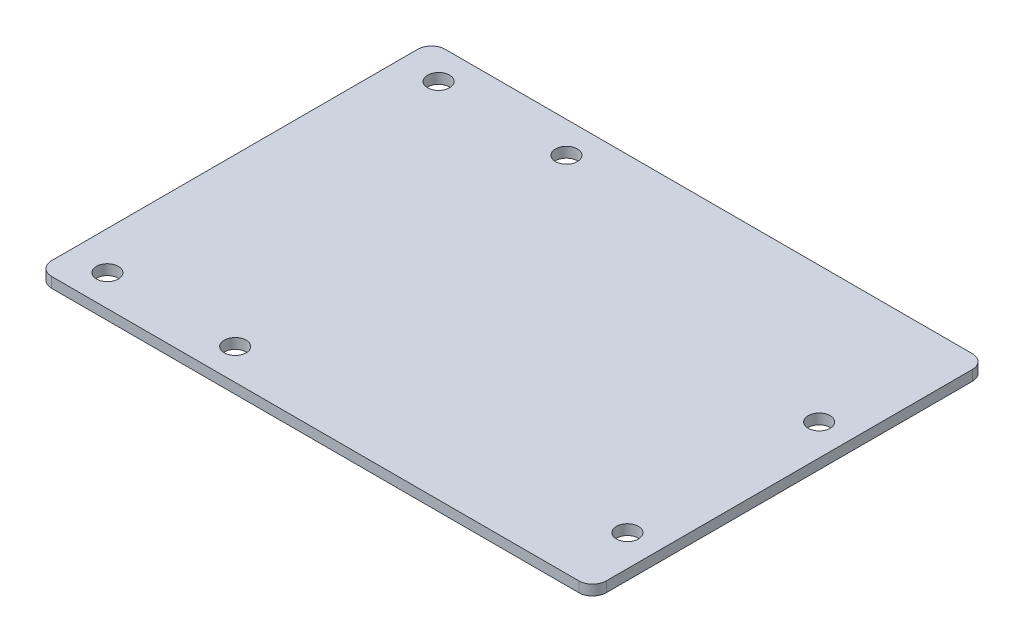
ISO-10303-21;
HEADER;
FILE_DESCRIPTION(('STEP AP214'),'2;1');
FILE_NAME('part.step','',(''),(''),'','','');
FILE_SCHEMA(('AUTOMOTIVE_DESIGN { 1 0 10303 214 1 1 1 1 }'));
ENDSEC;
DATA;
#1=APPLICATION_CONTEXT('core data for automotive mechanical design processes');
#2=APPLICATION_PROTOCOL_DEFINITION('international standard','automotive_design',2000,#1);
#3=PRODUCT_CONTEXT('',#1,'mechanical');
#4=PRODUCT('Part','Part','',(#3));
#5=PRODUCT_RELATED_PRODUCT_CATEGORY('part','',(#4));
#6=PRODUCT_DEFINITION_FORMATION('','',#4);
#7=PRODUCT_DEFINITION_CONTEXT('part definition',#1,'design');
#8=PRODUCT_DEFINITION('design','',#6,#7);
#9=PRODUCT_DEFINITION_SHAPE('','',#8);
#10=(LENGTH_UNIT() NAMED_UNIT(*) SI_UNIT(.MILLI.,.METRE.));
#11=(NAMED_UNIT(*) PLANE_ANGLE_UNIT() SI_UNIT($,.RADIAN.));
#12=(NAMED_UNIT(*) SI_UNIT($,.STERADIAN.) SOLID_ANGLE_UNIT());
#13=UNCERTAINTY_MEASURE_WITH_UNIT(LENGTH_MEASURE(1.E-05),#10,'distance_accuracy_value','');
#14=(GEOMETRIC_REPRESENTATION_CONTEXT(3) GLOBAL_UNCERTAINTY_ASSIGNED_CONTEXT((#13)) GLOBAL_UNIT_ASSIGNED_CONTEXT((#10,
#11,#12)) REPRESENTATION_CONTEXT('',''));
#15=CARTESIAN_POINT('',(0.,0.,0.));
#16=DIRECTION('',(0.,0.,1.));
#17=DIRECTION('',(1.,0.,0.));
#18=AXIS2_PLACEMENT_3D('',#15,#16,#17);
#19=CARTESIAN_POINT('',(0.,1.5,0.));
#20=DIRECTION('',(0.,1.,0.));
#21=DIRECTION('',(0.,0.,1.));
#22=AXIS2_PLACEMENT_3D('',#19,#20,#21);
#23=PLANE('',#22);
#24=CARTESIAN_POINT('',(32.96,1.5,19.05));
#25=DIRECTION('',(0.,1.,0.));
#26=DIRECTION('',(0.,0.,1.));
#27=AXIS2_PLACEMENT_3D('',#24,#25,#26);
#28=CIRCLE('',#27,1.6);
#29=CARTESIAN_POINT('',(32.96,1.5,20.65));
#30=VERTEX_POINT('',#29);
#31=EDGE_CURVE('E204',#30,#30,#28,.T.);
#32=ORIENTED_EDGE('',*,*,#31,.F.);
#33=EDGE_LOOP('',(#32));
#34=FACE_BOUND('',#33,.T.);
#35=CARTESIAN_POINT('',(-19.11,1.5,24.13));
#36=DIRECTION('',(0.,1.,0.));
#37=DIRECTION('',(0.,0.,1.));
#38=AXIS2_PLACEMENT_3D('',#35,#36,#37);
#39=CIRCLE('',#38,1.6);
#40=CARTESIAN_POINT('',(-19.11,1.5,25.73));
#41=VERTEX_POINT('',#40);
#42=EDGE_CURVE('E192',#41,#41,#39,.T.);
#43=ORIENTED_EDGE('',*,*,#42,.F.);
#44=EDGE_LOOP('',(#43));
#45=FACE_BOUND('',#44,.T.);
#46=CARTESIAN_POINT('',(-19.11,1.5,-24.13));
#47=DIRECTION('',(0.,1.,0.));
#48=DIRECTION('',(0.,0.,-1.));
#49=AXIS2_PLACEMENT_3D('',#46,#47,#48);
#50=CIRCLE('',#49,1.6);
#51=CARTESIAN_POINT('',(-19.11,1.5,-25.73));
#52=VERTEX_POINT('',#51);
#53=EDGE_CURVE('E182',#52,#52,#50,.T.);
#54=ORIENTED_EDGE('',*,*,#53,.F.);
#55=EDGE_LOOP('',(#54));
#56=FACE_BOUND('',#55,.T.);
#57=DIRECTION('',(-1.,0.,0.));
#58=VECTOR('',#57,1.);
#59=CARTESIAN_POINT('',(-43.3191078535778,1.5,-28.67));
#60=LINE('',#59,#58);
#61=CARTESIAN_POINT('',(35.5,1.5,-28.67));
#62=VERTEX_POINT('',#61);
#63=CARTESIAN_POINT('',(-41.3191078535778,1.5,-28.67));
#64=VERTEX_POINT('',#63);
#65=EDGE_CURVE('E173',#62,#64,#60,.T.);
#66=ORIENTED_EDGE('',*,*,#65,.T.);
#67=CARTESIAN_POINT('',(-41.3191078535778,1.5,-26.67));
#68=DIRECTION('',(0.,1.,0.));
#69=DIRECTION('',(0.,0.,1.));
#70=AXIS2_PLACEMENT_3D('',#67,#68,#69);
#71=CIRCLE('',#70,2.);
#72=CARTESIAN_POINT('',(-43.3191078535778,1.5,-26.67));
#73=VERTEX_POINT('',#72);
#74=EDGE_CURVE('E151',#64,#73,#71,.T.);
#75=ORIENTED_EDGE('',*,*,#74,.T.);
#76=DIRECTION('',(0.,0.,1.));
#77=VECTOR('',#76,1.);
#78=CARTESIAN_POINT('',(-43.3191078535778,1.5,-28.67));
#79=LINE('',#78,#77);
#80=CARTESIAN_POINT('',(-43.3191078535778,1.5,26.67));
#81=VERTEX_POINT('',#80);
#82=EDGE_CURVE('E121',#73,#81,#79,.T.);
#83=ORIENTED_EDGE('',*,*,#82,.T.);
#84=CARTESIAN_POINT('',(-41.3191078535778,1.5,26.67));
#85=DIRECTION('',(0.,1.,0.));
#86=DIRECTION('',(0.,0.,1.));
#87=AXIS2_PLACEMENT_3D('',#84,#85,#86);
#88=CIRCLE('',#87,2.);
#89=CARTESIAN_POINT('',(-41.3191078535778,1.5,28.67));
#90=VERTEX_POINT('',#89);
#91=EDGE_CURVE('E57',#81,#90,#88,.T.);
#92=ORIENTED_EDGE('',*,*,#91,.T.);
#93=DIRECTION('',(1.,0.,0.));
#94=VECTOR('',#93,1.);
#95=CARTESIAN_POINT('',(-43.3191078535778,1.5,28.67));
#96=LINE('',#95,#94);
#97=CARTESIAN_POINT('',(35.5,1.5,28.67));
#98=VERTEX_POINT('',#97);
#99=EDGE_CURVE('E137',#90,#98,#96,.T.);
#100=ORIENTED_EDGE('',*,*,#99,.T.);
#101=CARTESIAN_POINT('',(35.5,1.5,26.67));
#102=DIRECTION('',(0.,1.,0.));
#103=DIRECTION('',(0.,0.,1.));
#104=AXIS2_PLACEMENT_3D('',#101,#102,#103);
#105=CIRCLE('',#104,2.);
#106=CARTESIAN_POINT('',(37.5,1.5,26.67));
#107=VERTEX_POINT('',#106);
#108=EDGE_CURVE('E147',#98,#107,#105,.T.);
#109=ORIENTED_EDGE('',*,*,#108,.T.);
#110=DIRECTION('',(0.,0.,-1.));
#111=VECTOR('',#110,1.);
#112=CARTESIAN_POINT('',(37.5,1.5,-28.67));
#113=LINE('',#112,#111);
#114=CARTESIAN_POINT('',(37.5,1.5,-26.67));
#115=VERTEX_POINT('',#114);
#116=EDGE_CURVE('E131',#107,#115,#113,.T.);
#117=ORIENTED_EDGE('',*,*,#116,.T.);
#118=CARTESIAN_POINT('',(35.5,1.5,-26.67));
#119=DIRECTION('',(0.,1.,0.));
#120=DIRECTION('',(0.,0.,1.));
#121=AXIS2_PLACEMENT_3D('',#118,#119,#120);
#122=CIRCLE('',#121,2.);
#123=EDGE_CURVE('E149',#115,#62,#122,.T.);
#124=ORIENTED_EDGE('',*,*,#123,.T.);
#125=EDGE_LOOP('',(#66,#75,#83,#92,#100,#109,#117,#124));
#126=FACE_BOUND('',#125,.T.);
#127=CARTESIAN_POINT('',(-37.736271759555,1.5,-24.13));
#128=DIRECTION('',(0.,1.,0.));
#129=DIRECTION('',(0.,0.,1.));
#130=AXIS2_PLACEMENT_3D('',#127,#128,#129);
#131=CIRCLE('',#130,1.6);
#132=CARTESIAN_POINT('',(-37.736271759555,1.5,-22.53));
#133=VERTEX_POINT('',#132);
#134=EDGE_CURVE('E187',#133,#133,#131,.T.);
#135=ORIENTED_EDGE('',*,*,#134,.F.);
#136=EDGE_LOOP('',(#135));
#137=FACE_BOUND('',#136,.T.);
#138=CARTESIAN_POINT('',(-37.736271759555,1.5,24.13));
#139=DIRECTION('',(0.,1.,0.));
#140=DIRECTION('',(0.,0.,-1.));
#141=AXIS2_PLACEMENT_3D('',#138,#139,#140);
#142=CIRCLE('',#141,1.6);
#143=CARTESIAN_POINT('',(-37.736271759555,1.5,22.53));
#144=VERTEX_POINT('',#143);
#145=EDGE_CURVE('E198',#144,#144,#142,.T.);
#146=ORIENTED_EDGE('',*,*,#145,.F.);
#147=EDGE_LOOP('',(#146));
#148=FACE_BOUND('',#147,.T.);
#149=CARTESIAN_POINT('',(32.96,1.5,-8.89000000000001));
#150=DIRECTION('',(0.,1.,0.));
#151=DIRECTION('',(0.,0.,1.));
#152=AXIS2_PLACEMENT_3D('',#149,#150,#151);
#153=CIRCLE('',#152,1.6);
#154=CARTESIAN_POINT('',(32.96,1.5,-7.29));
#155=VERTEX_POINT('',#154);
#156=EDGE_CURVE('E210',#155,#155,#153,.T.);
#157=ORIENTED_EDGE('',*,*,#156,.F.);
#158=EDGE_LOOP('',(#157));
#159=FACE_BOUND('',#158,.T.);
#160=ADVANCED_FACE('F37',(#34,#45,#56,#126,#137,#148,#159),#23,.T.);
#161=CARTESIAN_POINT('',(0.,0.,0.));
#162=DIRECTION('',(0.,1.,0.));
#163=DIRECTION('',(0.,0.,1.));
#164=AXIS2_PLACEMENT_3D('',#161,#162,#163);
#165=PLANE('',#164);
#166=DIRECTION('',(0.,0.,1.));
#167=VECTOR('',#166,1.);
#168=CARTESIAN_POINT('',(-43.3191078535778,0.,-28.67));
#169=LINE('',#168,#167);
#170=CARTESIAN_POINT('',(-43.3191078535778,0.,-26.67));
#171=VERTEX_POINT('',#170);
#172=CARTESIAN_POINT('',(-43.3191078535778,0.,26.67));
#173=VERTEX_POINT('',#172);
#174=EDGE_CURVE('E119',#171,#173,#169,.T.);
#175=ORIENTED_EDGE('',*,*,#174,.F.);
#176=CARTESIAN_POINT('',(-41.3191078535778,0.,-26.67));
#177=DIRECTION('',(0.,1.,0.));
#178=DIRECTION('',(0.,0.,1.));
#179=AXIS2_PLACEMENT_3D('',#176,#177,#178);
#180=CIRCLE('',#179,2.);
#181=CARTESIAN_POINT('',(-41.3191078535778,0.,-28.67));
#182=VERTEX_POINT('',#181);
#183=EDGE_CURVE('E102',#171,#182,#180,.F.);
#184=ORIENTED_EDGE('',*,*,#183,.T.);
#185=DIRECTION('',(-1.,0.,0.));
#186=VECTOR('',#185,1.);
#187=CARTESIAN_POINT('',(-43.3191078535778,0.,-28.67));
#188=LINE('',#187,#186);
#189=CARTESIAN_POINT('',(35.5,0.,-28.67));
#190=VERTEX_POINT('',#189);
#191=EDGE_CURVE('E129',#190,#182,#188,.T.);
#192=ORIENTED_EDGE('',*,*,#191,.F.);
#193=CARTESIAN_POINT('',(35.5,0.,-26.67));
#194=DIRECTION('',(0.,1.,0.));
#195=DIRECTION('',(0.,0.,1.));
#196=AXIS2_PLACEMENT_3D('',#193,#194,#195);
#197=CIRCLE('',#196,2.);
#198=CARTESIAN_POINT('',(37.5,0.,-26.67));
#199=VERTEX_POINT('',#198);
#200=EDGE_CURVE('E113',#190,#199,#197,.F.);
#201=ORIENTED_EDGE('',*,*,#200,.T.);
#202=DIRECTION('',(0.,0.,-1.));
#203=VECTOR('',#202,1.);
#204=CARTESIAN_POINT('',(37.5,0.,-28.67));
#205=LINE('',#204,#203);
#206=CARTESIAN_POINT('',(37.5,0.,26.67));
#207=VERTEX_POINT('',#206);
#208=EDGE_CURVE('E133',#207,#199,#205,.T.);
#209=ORIENTED_EDGE('',*,*,#208,.F.);
#210=CARTESIAN_POINT('',(35.5,0.,26.67));
#211=DIRECTION('',(0.,1.,0.));
#212=DIRECTION('',(0.,0.,1.));
#213=AXIS2_PLACEMENT_3D('',#210,#211,#212);
#214=CIRCLE('',#213,2.);
#215=CARTESIAN_POINT('',(35.5,0.,28.67));
#216=VERTEX_POINT('',#215);
#217=EDGE_CURVE('E140',#207,#216,#214,.F.);
#218=ORIENTED_EDGE('',*,*,#217,.T.);
#219=DIRECTION('',(1.,0.,0.));
#220=VECTOR('',#219,1.);
#221=CARTESIAN_POINT('',(-43.3191078535778,0.,28.67));
#222=LINE('',#221,#220);
#223=CARTESIAN_POINT('',(-41.3191078535778,0.,28.67));
#224=VERTEX_POINT('',#223);
#225=EDGE_CURVE('E128',#224,#216,#222,.T.);
#226=ORIENTED_EDGE('',*,*,#225,.F.);
#227=CARTESIAN_POINT('',(-41.3191078535778,0.,26.67));
#228=DIRECTION('',(0.,1.,0.));
#229=DIRECTION('',(0.,0.,1.));
#230=AXIS2_PLACEMENT_3D('',#227,#228,#229);
#231=CIRCLE('',#230,2.);
#232=EDGE_CURVE('E122',#224,#173,#231,.F.);
#233=ORIENTED_EDGE('',*,*,#232,.T.);
#234=EDGE_LOOP('',(#175,#184,#192,#201,#209,#218,#226,#233));
#235=FACE_BOUND('',#234,.T.);
#236=CARTESIAN_POINT('',(-19.11,0.,-24.13));
#237=DIRECTION('',(0.,1.,0.));
#238=DIRECTION('',(0.,0.,-1.));
#239=AXIS2_PLACEMENT_3D('',#236,#237,#238);
#240=CIRCLE('',#239,1.6);
#241=CARTESIAN_POINT('',(-19.11,0.,-25.73));
#242=VERTEX_POINT('',#241);
#243=EDGE_CURVE('E178',#242,#242,#240,.T.);
#244=ORIENTED_EDGE('',*,*,#243,.T.);
#245=EDGE_LOOP('',(#244));
#246=FACE_BOUND('',#245,.T.);
#247=CARTESIAN_POINT('',(-37.736271759555,0.,-24.13));
#248=DIRECTION('',(0.,1.,0.));
#249=DIRECTION('',(0.,0.,1.));
#250=AXIS2_PLACEMENT_3D('',#247,#248,#249);
#251=CIRCLE('',#250,1.6);
#252=CARTESIAN_POINT('',(-37.736271759555,0.,-22.53));
#253=VERTEX_POINT('',#252);
#254=EDGE_CURVE('E189',#253,#253,#251,.T.);
#255=ORIENTED_EDGE('',*,*,#254,.T.);
#256=EDGE_LOOP('',(#255));
#257=FACE_BOUND('',#256,.T.);
#258=CARTESIAN_POINT('',(-19.11,0.,24.13));
#259=DIRECTION('',(0.,1.,0.));
#260=DIRECTION('',(0.,0.,1.));
#261=AXIS2_PLACEMENT_3D('',#258,#259,#260);
#262=CIRCLE('',#261,1.6);
#263=CARTESIAN_POINT('',(-19.11,0.,25.73));
#264=VERTEX_POINT('',#263);
#265=EDGE_CURVE('E195',#264,#264,#262,.T.);
#266=ORIENTED_EDGE('',*,*,#265,.T.);
#267=EDGE_LOOP('',(#266));
#268=FACE_BOUND('',#267,.T.);
#269=CARTESIAN_POINT('',(-37.736271759555,0.,24.13));
#270=DIRECTION('',(0.,1.,0.));
#271=DIRECTION('',(0.,0.,-1.));
#272=AXIS2_PLACEMENT_3D('',#269,#270,#271);
#273=CIRCLE('',#272,1.6);
#274=CARTESIAN_POINT('',(-37.736271759555,0.,22.53));
#275=VERTEX_POINT('',#274);
#276=EDGE_CURVE('E201',#275,#275,#273,.T.);
#277=ORIENTED_EDGE('',*,*,#276,.T.);
#278=EDGE_LOOP('',(#277));
#279=FACE_BOUND('',#278,.T.);
#280=CARTESIAN_POINT('',(32.96,0.,19.05));
#281=DIRECTION('',(0.,1.,0.));
#282=DIRECTION('',(0.,0.,1.));
#283=AXIS2_PLACEMENT_3D('',#280,#281,#282);
#284=CIRCLE('',#283,1.6);
#285=CARTESIAN_POINT('',(32.96,0.,20.65));
#286=VERTEX_POINT('',#285);
#287=EDGE_CURVE('E207',#286,#286,#284,.T.);
#288=ORIENTED_EDGE('',*,*,#287,.T.);
#289=EDGE_LOOP('',(#288));
#290=FACE_BOUND('',#289,.T.);
#291=CARTESIAN_POINT('',(32.96,0.,-8.89000000000001));
#292=DIRECTION('',(0.,1.,0.));
#293=DIRECTION('',(0.,0.,1.));
#294=AXIS2_PLACEMENT_3D('',#291,#292,#293);
#295=CIRCLE('',#294,1.6);
#296=CARTESIAN_POINT('',(32.96,0.,-7.29));
#297=VERTEX_POINT('',#296);
#298=EDGE_CURVE('E213',#297,#297,#295,.T.);
#299=ORIENTED_EDGE('',*,*,#298,.T.);
#300=EDGE_LOOP('',(#299));
#301=FACE_BOUND('',#300,.T.);
#302=ADVANCED_FACE('F125',(#235,#246,#257,#268,#279,#290,#301),#165,.F.);
#303=CARTESIAN_POINT('',(37.5,1.5,-28.67));
#304=DIRECTION('',(-1.,0.,0.));
#305=DIRECTION('',(0.,0.,1.));
#306=AXIS2_PLACEMENT_3D('',#303,#304,#305);
#307=PLANE('',#306);
#308=ORIENTED_EDGE('',*,*,#208,.T.);
#309=DIRECTION('',(0.,-1.,0.));
#310=VECTOR('',#309,1.);
#311=CARTESIAN_POINT('',(37.5,1.5,-26.67));
#312=LINE('',#311,#310);
#313=EDGE_CURVE('E156',#199,#115,#312,.F.);
#314=ORIENTED_EDGE('',*,*,#313,.T.);
#315=ORIENTED_EDGE('',*,*,#116,.F.);
#316=DIRECTION('',(0.,-1.,0.));
#317=VECTOR('',#316,1.);
#318=CARTESIAN_POINT('',(37.5,1.5,26.67));
#319=LINE('',#318,#317);
#320=EDGE_CURVE('E153',#107,#207,#319,.T.);
#321=ORIENTED_EDGE('',*,*,#320,.T.);
#322=EDGE_LOOP('',(#308,#314,#315,#321));
#323=FACE_BOUND('',#322,.T.);
#324=ADVANCED_FACE('F169',(#323),#307,.F.);
#325=CARTESIAN_POINT('',(-43.3191078535778,1.5,-28.67));
#326=DIRECTION('',(0.,0.,1.));
#327=DIRECTION('',(1.,0.,0.));
#328=AXIS2_PLACEMENT_3D('',#325,#326,#327);
#329=PLANE('',#328);
#330=ORIENTED_EDGE('',*,*,#191,.T.);
#331=DIRECTION('',(0.,-1.,0.));
#332=VECTOR('',#331,1.);
#333=CARTESIAN_POINT('',(-41.3191078535778,1.5,-28.67));
#334=LINE('',#333,#332);
#335=EDGE_CURVE('E107',#182,#64,#334,.F.);
#336=ORIENTED_EDGE('',*,*,#335,.T.);
#337=ORIENTED_EDGE('',*,*,#65,.F.);
#338=DIRECTION('',(0.,-1.,0.));
#339=VECTOR('',#338,1.);
#340=CARTESIAN_POINT('',(35.5,1.5,-28.67));
#341=LINE('',#340,#339);
#342=EDGE_CURVE('E112',#62,#190,#341,.T.);
#343=ORIENTED_EDGE('',*,*,#342,.T.);
#344=EDGE_LOOP('',(#330,#336,#337,#343));
#345=FACE_BOUND('',#344,.T.);
#346=ADVANCED_FACE('F238',(#345),#329,.F.);
#347=CARTESIAN_POINT('',(-43.3191078535778,1.5,-28.67));
#348=DIRECTION('',(1.,0.,0.));
#349=DIRECTION('',(0.,0.,-1.));
#350=AXIS2_PLACEMENT_3D('',#347,#348,#349);
#351=PLANE('',#350);
#352=ORIENTED_EDGE('',*,*,#82,.F.);
#353=DIRECTION('',(0.,-1.,0.));
#354=VECTOR('',#353,1.);
#355=CARTESIAN_POINT('',(-43.3191078535778,1.5,-26.67));
#356=LINE('',#355,#354);
#357=EDGE_CURVE('E106',#73,#171,#356,.T.);
#358=ORIENTED_EDGE('',*,*,#357,.T.);
#359=ORIENTED_EDGE('',*,*,#174,.T.);
#360=DIRECTION('',(0.,-1.,0.));
#361=VECTOR('',#360,1.);
#362=CARTESIAN_POINT('',(-43.3191078535778,1.5,26.67));
#363=LINE('',#362,#361);
#364=EDGE_CURVE('E123',#173,#81,#363,.F.);
#365=ORIENTED_EDGE('',*,*,#364,.T.);
#366=EDGE_LOOP('',(#352,#358,#359,#365));
#367=FACE_BOUND('',#366,.T.);
#368=ADVANCED_FACE('F118',(#367),#351,.F.);
#369=CARTESIAN_POINT('',(-43.3191078535778,1.5,28.67));
#370=DIRECTION('',(0.,0.,-1.));
#371=DIRECTION('',(-1.,0.,0.));
#372=AXIS2_PLACEMENT_3D('',#369,#370,#371);
#373=PLANE('',#372);
#374=ORIENTED_EDGE('',*,*,#225,.T.);
#375=DIRECTION('',(0.,-1.,0.));
#376=VECTOR('',#375,1.);
#377=CARTESIAN_POINT('',(35.5,1.5,28.67));
#378=LINE('',#377,#376);
#379=EDGE_CURVE('E11',#216,#98,#378,.F.);
#380=ORIENTED_EDGE('',*,*,#379,.T.);
#381=ORIENTED_EDGE('',*,*,#99,.F.);
#382=DIRECTION('',(0.,-1.,0.));
#383=VECTOR('',#382,1.);
#384=CARTESIAN_POINT('',(-41.3191078535778,1.5,28.67));
#385=LINE('',#384,#383);
#386=EDGE_CURVE('E45',#90,#224,#385,.T.);
#387=ORIENTED_EDGE('',*,*,#386,.T.);
#388=EDGE_LOOP('',(#374,#380,#381,#387));
#389=FACE_BOUND('',#388,.T.);
#390=ADVANCED_FACE('F159',(#389),#373,.F.);
#391=CARTESIAN_POINT('',(-19.11,1.5,-24.13));
#392=DIRECTION('',(0.,-1.,0.));
#393=DIRECTION('',(0.,0.,-1.));
#394=AXIS2_PLACEMENT_3D('',#391,#392,#393);
#395=CYLINDRICAL_SURFACE('',#394,1.6);
#396=ORIENTED_EDGE('',*,*,#243,.F.);
#397=EDGE_LOOP('',(#396));
#398=FACE_BOUND('',#397,.T.);
#399=ORIENTED_EDGE('',*,*,#53,.T.);
#400=EDGE_LOOP('',(#399));
#401=FACE_BOUND('',#400,.T.);
#402=ADVANCED_FACE('F231',(#398,#401),#395,.F.);
#403=CARTESIAN_POINT('',(-37.736271759555,1.5,-24.13));
#404=DIRECTION('',(0.,-1.,0.));
#405=DIRECTION('',(0.,0.,-1.));
#406=AXIS2_PLACEMENT_3D('',#403,#404,#405);
#407=CYLINDRICAL_SURFACE('',#406,1.6);
#408=ORIENTED_EDGE('',*,*,#134,.T.);
#409=EDGE_LOOP('',(#408));
#410=FACE_BOUND('',#409,.T.);
#411=ORIENTED_EDGE('',*,*,#254,.F.);
#412=EDGE_LOOP('',(#411));
#413=FACE_BOUND('',#412,.T.);
#414=ADVANCED_FACE('F284',(#410,#413),#407,.F.);
#415=CARTESIAN_POINT('',(-19.11,1.5,24.13));
#416=DIRECTION('',(0.,-1.,0.));
#417=DIRECTION('',(0.,0.,-1.));
#418=AXIS2_PLACEMENT_3D('',#415,#416,#417);
#419=CYLINDRICAL_SURFACE('',#418,1.6);
#420=ORIENTED_EDGE('',*,*,#265,.F.);
#421=EDGE_LOOP('',(#420));
#422=FACE_BOUND('',#421,.T.);
#423=ORIENTED_EDGE('',*,*,#42,.T.);
#424=EDGE_LOOP('',(#423));
#425=FACE_BOUND('',#424,.T.);
#426=ADVANCED_FACE('F266',(#422,#425),#419,.F.);
#427=CARTESIAN_POINT('',(-37.736271759555,1.5,24.13));
#428=DIRECTION('',(0.,-1.,0.));
#429=DIRECTION('',(0.,0.,-1.));
#430=AXIS2_PLACEMENT_3D('',#427,#428,#429);
#431=CYLINDRICAL_SURFACE('',#430,1.6);
#432=ORIENTED_EDGE('',*,*,#145,.T.);
#433=EDGE_LOOP('',(#432));
#434=FACE_BOUND('',#433,.T.);
#435=ORIENTED_EDGE('',*,*,#276,.F.);
#436=EDGE_LOOP('',(#435));
#437=FACE_BOUND('',#436,.T.);
#438=ADVANCED_FACE('F262',(#434,#437),#431,.F.);
#439=CARTESIAN_POINT('',(32.96,1.5,19.05));
#440=DIRECTION('',(0.,-1.,0.));
#441=DIRECTION('',(0.,0.,-1.));
#442=AXIS2_PLACEMENT_3D('',#439,#440,#441);
#443=CYLINDRICAL_SURFACE('',#442,1.6);
#444=ORIENTED_EDGE('',*,*,#287,.F.);
#445=EDGE_LOOP('',(#444));
#446=FACE_BOUND('',#445,.T.);
#447=ORIENTED_EDGE('',*,*,#31,.T.);
#448=EDGE_LOOP('',(#447));
#449=FACE_BOUND('',#448,.T.);
#450=ADVANCED_FACE('F265',(#446,#449),#443,.F.);
#451=CARTESIAN_POINT('',(32.96,1.5,-8.89000000000001));
#452=DIRECTION('',(0.,-1.,0.));
#453=DIRECTION('',(0.,0.,-1.));
#454=AXIS2_PLACEMENT_3D('',#451,#452,#453);
#455=CYLINDRICAL_SURFACE('',#454,1.6);
#456=ORIENTED_EDGE('',*,*,#298,.F.);
#457=EDGE_LOOP('',(#456));
#458=FACE_BOUND('',#457,.T.);
#459=ORIENTED_EDGE('',*,*,#156,.T.);
#460=EDGE_LOOP('',(#459));
#461=FACE_BOUND('',#460,.T.);
#462=ADVANCED_FACE('F219',(#458,#461),#455,.F.);
#463=CARTESIAN_POINT('',(-41.3191078535778,1.5,-26.67));
#464=DIRECTION('',(0.,-1.,0.));
#465=DIRECTION('',(0.,0.,-1.));
#466=AXIS2_PLACEMENT_3D('',#463,#464,#465);
#467=CYLINDRICAL_SURFACE('',#466,2.);
#468=ORIENTED_EDGE('',*,*,#74,.F.);
#469=ORIENTED_EDGE('',*,*,#335,.F.);
#470=ORIENTED_EDGE('',*,*,#183,.F.);
#471=ORIENTED_EDGE('',*,*,#357,.F.);
#472=EDGE_LOOP('',(#468,#469,#470,#471));
#473=FACE_BOUND('',#472,.T.);
#474=ADVANCED_FACE('F105',(#473),#467,.T.);
#475=CARTESIAN_POINT('',(35.5,1.5,-26.67));
#476=DIRECTION('',(0.,-1.,0.));
#477=DIRECTION('',(0.,0.,-1.));
#478=AXIS2_PLACEMENT_3D('',#475,#476,#477);
#479=CYLINDRICAL_SURFACE('',#478,2.);
#480=ORIENTED_EDGE('',*,*,#123,.F.);
#481=ORIENTED_EDGE('',*,*,#313,.F.);
#482=ORIENTED_EDGE('',*,*,#200,.F.);
#483=ORIENTED_EDGE('',*,*,#342,.F.);
#484=EDGE_LOOP('',(#480,#481,#482,#483));
#485=FACE_BOUND('',#484,.T.);
#486=ADVANCED_FACE('F246',(#485),#479,.T.);
#487=CARTESIAN_POINT('',(35.5,1.5,26.67));
#488=DIRECTION('',(0.,-1.,0.));
#489=DIRECTION('',(0.,0.,-1.));
#490=AXIS2_PLACEMENT_3D('',#487,#488,#489);
#491=CYLINDRICAL_SURFACE('',#490,2.);
#492=ORIENTED_EDGE('',*,*,#108,.F.);
#493=ORIENTED_EDGE('',*,*,#379,.F.);
#494=ORIENTED_EDGE('',*,*,#217,.F.);
#495=ORIENTED_EDGE('',*,*,#320,.F.);
#496=EDGE_LOOP('',(#492,#493,#494,#495));
#497=FACE_BOUND('',#496,.T.);
#498=ADVANCED_FACE('F166',(#497),#491,.T.);
#499=CARTESIAN_POINT('',(-41.3191078535778,1.5,26.67));
#500=DIRECTION('',(0.,-1.,0.));
#501=DIRECTION('',(0.,0.,-1.));
#502=AXIS2_PLACEMENT_3D('',#499,#500,#501);
#503=CYLINDRICAL_SURFACE('',#502,2.);
#504=ORIENTED_EDGE('',*,*,#91,.F.);
#505=ORIENTED_EDGE('',*,*,#364,.F.);
#506=ORIENTED_EDGE('',*,*,#232,.F.);
#507=ORIENTED_EDGE('',*,*,#386,.F.);
#508=EDGE_LOOP('',(#504,#505,#506,#507));
#509=FACE_BOUND('',#508,.T.);
#510=ADVANCED_FACE('F39',(#509),#503,.T.);
#511=CLOSED_SHELL('',(#160,#302,#324,#346,#368,#390,#402,#414,#426,#438,#450,#462,#474,#486,
#498,#510));
#512=MANIFOLD_SOLID_BREP('B2',#511);
#513=ADVANCED_BREP_SHAPE_REPRESENTATION('',(#18,#512),#14);
#514=SHAPE_DEFINITION_REPRESENTATION(#9,#513);
ENDSEC;
END-ISO-10303-21;
